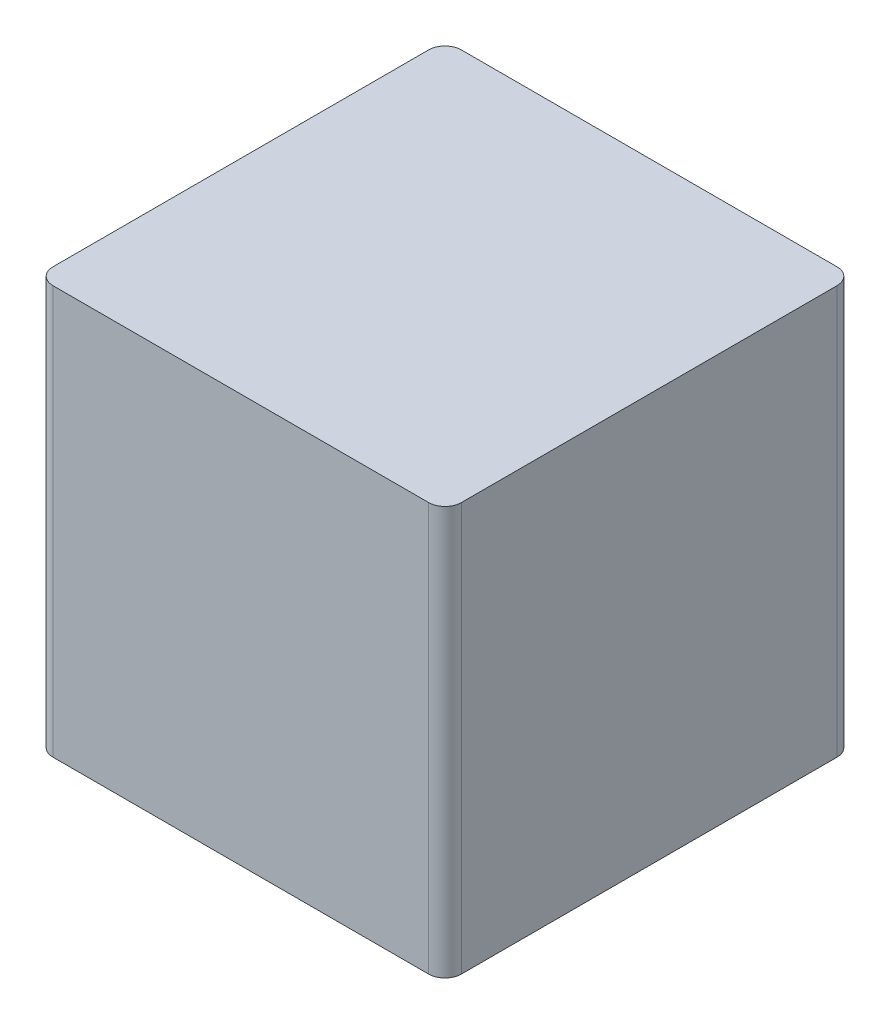
ISO-10303-21;
HEADER;
FILE_DESCRIPTION(('STEP AP214'),'2;1');
FILE_NAME('part.step','',(''),(''),'','','');
FILE_SCHEMA(('AUTOMOTIVE_DESIGN { 1 0 10303 214 1 1 1 1 }'));
ENDSEC;
DATA;
#1=APPLICATION_CONTEXT('core data for automotive mechanical design processes');
#2=APPLICATION_PROTOCOL_DEFINITION('international standard','automotive_design',2000,#1);
#3=PRODUCT_CONTEXT('',#1,'mechanical');
#4=PRODUCT('Part','Part','',(#3));
#5=PRODUCT_RELATED_PRODUCT_CATEGORY('part','',(#4));
#6=PRODUCT_DEFINITION_FORMATION('','',#4);
#7=PRODUCT_DEFINITION_CONTEXT('part definition',#1,'design');
#8=PRODUCT_DEFINITION('design','',#6,#7);
#9=PRODUCT_DEFINITION_SHAPE('','',#8);
#10=(LENGTH_UNIT() NAMED_UNIT(*) SI_UNIT(.MILLI.,.METRE.));
#11=(NAMED_UNIT(*) PLANE_ANGLE_UNIT() SI_UNIT($,.RADIAN.));
#12=(NAMED_UNIT(*) SI_UNIT($,.STERADIAN.) SOLID_ANGLE_UNIT());
#13=UNCERTAINTY_MEASURE_WITH_UNIT(LENGTH_MEASURE(1.E-05),#10,'distance_accuracy_value','');
#14=(GEOMETRIC_REPRESENTATION_CONTEXT(3) GLOBAL_UNCERTAINTY_ASSIGNED_CONTEXT((#13)) GLOBAL_UNIT_ASSIGNED_CONTEXT((#10,
#11,#12)) REPRESENTATION_CONTEXT('',''));
#15=CARTESIAN_POINT('',(0.,0.,0.));
#16=DIRECTION('',(0.,0.,1.));
#17=DIRECTION('',(1.,0.,0.));
#18=AXIS2_PLACEMENT_3D('',#15,#16,#17);
#19=CARTESIAN_POINT('',(31.75,63.5000000000001,31.75));
#20=DIRECTION('',(0.,0.,1.));
#21=DIRECTION('',(1.,0.,0.));
#22=AXIS2_PLACEMENT_3D('',#19,#20,#21);
#23=PLANE('',#22);
#24=DIRECTION('',(-1.,0.,0.));
#25=VECTOR('',#24,1.);
#26=CARTESIAN_POINT('',(31.75,63.5000000000001,31.75));
#27=LINE('',#26,#25);
#28=CARTESIAN_POINT('',(29.21,63.5000000000001,31.75));
#29=VERTEX_POINT('',#28);
#30=CARTESIAN_POINT('',(-29.21,63.5000000000001,31.75));
#31=VERTEX_POINT('',#30);
#32=EDGE_CURVE('E195',#29,#31,#27,.T.);
#33=ORIENTED_EDGE('',*,*,#32,.T.);
#34=DIRECTION('',(0.,-1.,0.));
#35=VECTOR('',#34,1.);
#36=CARTESIAN_POINT('',(-29.21,0.,31.75));
#37=LINE('',#36,#35);
#38=CARTESIAN_POINT('',(-29.21,0.,31.75));
#39=VERTEX_POINT('',#38);
#40=EDGE_CURVE('E124',#31,#39,#37,.T.);
#41=ORIENTED_EDGE('',*,*,#40,.T.);
#42=DIRECTION('',(-1.,0.,0.));
#43=VECTOR('',#42,1.);
#44=CARTESIAN_POINT('',(31.75,0.,31.75));
#45=LINE('',#44,#43);
#46=CARTESIAN_POINT('',(29.21,0.,31.75));
#47=VERTEX_POINT('',#46);
#48=EDGE_CURVE('E115',#47,#39,#45,.T.);
#49=ORIENTED_EDGE('',*,*,#48,.F.);
#50=DIRECTION('',(0.,-1.,0.));
#51=VECTOR('',#50,1.);
#52=CARTESIAN_POINT('',(29.21,63.5000000000001,31.75));
#53=LINE('',#52,#51);
#54=EDGE_CURVE('E129',#47,#29,#53,.F.);
#55=ORIENTED_EDGE('',*,*,#54,.T.);
#56=EDGE_LOOP('',(#33,#41,#49,#55));
#57=FACE_BOUND('',#56,.T.);
#58=ADVANCED_FACE('F45',(#57),#23,.T.);
#59=CARTESIAN_POINT('',(31.75,63.5000000000001,-31.75));
#60=DIRECTION('',(1.,0.,0.));
#61=DIRECTION('',(0.,0.,-1.));
#62=AXIS2_PLACEMENT_3D('',#59,#60,#61);
#63=PLANE('',#62);
#64=DIRECTION('',(0.,0.,1.));
#65=VECTOR('',#64,1.);
#66=CARTESIAN_POINT('',(31.75,0.,-31.75));
#67=LINE('',#66,#65);
#68=CARTESIAN_POINT('',(31.75,0.,-29.21));
#69=VERTEX_POINT('',#68);
#70=CARTESIAN_POINT('',(31.75,0.,29.21));
#71=VERTEX_POINT('',#70);
#72=EDGE_CURVE('E117',#69,#71,#67,.T.);
#73=ORIENTED_EDGE('',*,*,#72,.F.);
#74=DIRECTION('',(0.,-1.,0.));
#75=VECTOR('',#74,1.);
#76=CARTESIAN_POINT('',(31.75,63.5000000000001,-29.21));
#77=LINE('',#76,#75);
#78=CARTESIAN_POINT('',(31.75,63.5000000000001,-29.21));
#79=VERTEX_POINT('',#78);
#80=EDGE_CURVE('E11',#69,#79,#77,.F.);
#81=ORIENTED_EDGE('',*,*,#80,.T.);
#82=DIRECTION('',(0.,0.,1.));
#83=VECTOR('',#82,1.);
#84=CARTESIAN_POINT('',(31.75,63.5000000000001,-31.75));
#85=LINE('',#84,#83);
#86=CARTESIAN_POINT('',(31.75,63.5000000000001,29.21));
#87=VERTEX_POINT('',#86);
#88=EDGE_CURVE('E138',#79,#87,#85,.T.);
#89=ORIENTED_EDGE('',*,*,#88,.T.);
#90=DIRECTION('',(0.,-1.,0.));
#91=VECTOR('',#90,1.);
#92=CARTESIAN_POINT('',(31.75,63.5000000000001,29.21));
#93=LINE('',#92,#91);
#94=EDGE_CURVE('E54',#87,#71,#93,.T.);
#95=ORIENTED_EDGE('',*,*,#94,.T.);
#96=EDGE_LOOP('',(#73,#81,#89,#95));
#97=FACE_BOUND('',#96,.T.);
#98=ADVANCED_FACE('F181',(#97),#63,.T.);
#99=CARTESIAN_POINT('',(31.75,63.5000000000001,-31.75));
#100=DIRECTION('',(0.,0.,1.));
#101=DIRECTION('',(1.,0.,0.));
#102=AXIS2_PLACEMENT_3D('',#99,#100,#101);
#103=PLANE('',#102);
#104=DIRECTION('',(-1.,0.,0.));
#105=VECTOR('',#104,1.);
#106=CARTESIAN_POINT('',(31.75,0.,-31.75));
#107=LINE('',#106,#105);
#108=CARTESIAN_POINT('',(29.21,0.,-31.75));
#109=VERTEX_POINT('',#108);
#110=CARTESIAN_POINT('',(-29.21,0.,-31.75));
#111=VERTEX_POINT('',#110);
#112=EDGE_CURVE('E190',#109,#111,#107,.T.);
#113=ORIENTED_EDGE('',*,*,#112,.T.);
#114=DIRECTION('',(0.,-1.,0.));
#115=VECTOR('',#114,1.);
#116=CARTESIAN_POINT('',(-29.21,63.5000000000001,-31.75));
#117=LINE('',#116,#115);
#118=CARTESIAN_POINT('',(-29.21,63.5000000000001,-31.75));
#119=VERTEX_POINT('',#118);
#120=EDGE_CURVE('E61',#111,#119,#117,.F.);
#121=ORIENTED_EDGE('',*,*,#120,.T.);
#122=DIRECTION('',(-1.,0.,0.));
#123=VECTOR('',#122,1.);
#124=CARTESIAN_POINT('',(31.75,63.5000000000001,-31.75));
#125=LINE('',#124,#123);
#126=CARTESIAN_POINT('',(29.21,63.5000000000001,-31.75));
#127=VERTEX_POINT('',#126);
#128=EDGE_CURVE('E144',#127,#119,#125,.T.);
#129=ORIENTED_EDGE('',*,*,#128,.F.);
#130=DIRECTION('',(0.,-1.,0.));
#131=VECTOR('',#130,1.);
#132=CARTESIAN_POINT('',(29.21,0.,-31.75));
#133=LINE('',#132,#131);
#134=EDGE_CURVE('E174',#127,#109,#133,.T.);
#135=ORIENTED_EDGE('',*,*,#134,.T.);
#136=EDGE_LOOP('',(#113,#121,#129,#135));
#137=FACE_BOUND('',#136,.T.);
#138=ADVANCED_FACE('F189',(#137),#103,.F.);
#139=CARTESIAN_POINT('',(-31.75,63.5000000000001,-31.75));
#140=DIRECTION('',(1.,0.,0.));
#141=DIRECTION('',(0.,0.,-1.));
#142=AXIS2_PLACEMENT_3D('',#139,#140,#141);
#143=PLANE('',#142);
#144=DIRECTION('',(0.,0.,1.));
#145=VECTOR('',#144,1.);
#146=CARTESIAN_POINT('',(-31.75,0.,-31.75));
#147=LINE('',#146,#145);
#148=CARTESIAN_POINT('',(-31.75,0.,-29.21));
#149=VERTEX_POINT('',#148);
#150=CARTESIAN_POINT('',(-31.75,0.,29.21));
#151=VERTEX_POINT('',#150);
#152=EDGE_CURVE('E133',#149,#151,#147,.T.);
#153=ORIENTED_EDGE('',*,*,#152,.T.);
#154=DIRECTION('',(0.,-1.,0.));
#155=VECTOR('',#154,1.);
#156=CARTESIAN_POINT('',(-31.75,63.5000000000001,29.21));
#157=LINE('',#156,#155);
#158=CARTESIAN_POINT('',(-31.75,63.5000000000001,29.21));
#159=VERTEX_POINT('',#158);
#160=EDGE_CURVE('E161',#151,#159,#157,.F.);
#161=ORIENTED_EDGE('',*,*,#160,.T.);
#162=DIRECTION('',(0.,0.,1.));
#163=VECTOR('',#162,1.);
#164=CARTESIAN_POINT('',(-31.75,63.5000000000001,-31.75));
#165=LINE('',#164,#163);
#166=CARTESIAN_POINT('',(-31.75,63.5000000000001,-29.21));
#167=VERTEX_POINT('',#166);
#168=EDGE_CURVE('E201',#167,#159,#165,.T.);
#169=ORIENTED_EDGE('',*,*,#168,.F.);
#170=DIRECTION('',(0.,-1.,0.));
#171=VECTOR('',#170,1.);
#172=CARTESIAN_POINT('',(-31.75,63.5000000000001,-29.21));
#173=LINE('',#172,#171);
#174=EDGE_CURVE('E157',#167,#149,#173,.T.);
#175=ORIENTED_EDGE('',*,*,#174,.T.);
#176=EDGE_LOOP('',(#153,#161,#169,#175));
#177=FACE_BOUND('',#176,.T.);
#178=ADVANCED_FACE('F210',(#177),#143,.F.);
#179=CARTESIAN_POINT('',(0.,63.5000000000001,0.));
#180=DIRECTION('',(0.,1.,0.));
#181=DIRECTION('',(0.,0.,1.));
#182=AXIS2_PLACEMENT_3D('',#179,#180,#181);
#183=PLANE('',#182);
#184=ORIENTED_EDGE('',*,*,#168,.T.);
#185=CARTESIAN_POINT('',(-29.21,63.5000000000001,29.21));
#186=DIRECTION('',(0.,1.,0.));
#187=DIRECTION('',(0.,0.,1.));
#188=AXIS2_PLACEMENT_3D('',#185,#186,#187);
#189=CIRCLE('',#188,2.54);
#190=EDGE_CURVE('E171',#159,#31,#189,.T.);
#191=ORIENTED_EDGE('',*,*,#190,.T.);
#192=ORIENTED_EDGE('',*,*,#32,.F.);
#193=CARTESIAN_POINT('',(29.21,63.5000000000001,29.21));
#194=DIRECTION('',(0.,1.,0.));
#195=DIRECTION('',(0.,0.,1.));
#196=AXIS2_PLACEMENT_3D('',#193,#194,#195);
#197=CIRCLE('',#196,2.54);
#198=EDGE_CURVE('E136',#29,#87,#197,.T.);
#199=ORIENTED_EDGE('',*,*,#198,.T.);
#200=ORIENTED_EDGE('',*,*,#88,.F.);
#201=CARTESIAN_POINT('',(29.21,63.5000000000001,-29.21));
#202=DIRECTION('',(0.,1.,0.));
#203=DIRECTION('',(0.,0.,1.));
#204=AXIS2_PLACEMENT_3D('',#201,#202,#203);
#205=CIRCLE('',#204,2.54);
#206=EDGE_CURVE('E68',#79,#127,#205,.T.);
#207=ORIENTED_EDGE('',*,*,#206,.T.);
#208=ORIENTED_EDGE('',*,*,#128,.T.);
#209=CARTESIAN_POINT('',(-29.21,63.5000000000001,-29.21));
#210=DIRECTION('',(0.,1.,0.));
#211=DIRECTION('',(0.,0.,1.));
#212=AXIS2_PLACEMENT_3D('',#209,#210,#211);
#213=CIRCLE('',#212,2.54);
#214=EDGE_CURVE('E168',#119,#167,#213,.T.);
#215=ORIENTED_EDGE('',*,*,#214,.T.);
#216=EDGE_LOOP('',(#184,#191,#192,#199,#200,#207,#208,#215));
#217=FACE_BOUND('',#216,.T.);
#218=ADVANCED_FACE('F184',(#217),#183,.T.);
#219=CARTESIAN_POINT('',(0.,0.,0.));
#220=DIRECTION('',(0.,1.,0.));
#221=DIRECTION('',(0.,0.,1.));
#222=AXIS2_PLACEMENT_3D('',#219,#220,#221);
#223=PLANE('',#222);
#224=ORIENTED_EDGE('',*,*,#48,.T.);
#225=CARTESIAN_POINT('',(-29.21,0.,29.21));
#226=DIRECTION('',(0.,1.,0.));
#227=DIRECTION('',(0.,0.,1.));
#228=AXIS2_PLACEMENT_3D('',#225,#226,#227);
#229=CIRCLE('',#228,2.54);
#230=EDGE_CURVE('E154',#39,#151,#229,.F.);
#231=ORIENTED_EDGE('',*,*,#230,.T.);
#232=ORIENTED_EDGE('',*,*,#152,.F.);
#233=CARTESIAN_POINT('',(-29.21,0.,-29.21));
#234=DIRECTION('',(0.,1.,0.));
#235=DIRECTION('',(0.,0.,1.));
#236=AXIS2_PLACEMENT_3D('',#233,#234,#235);
#237=CIRCLE('',#236,2.54);
#238=EDGE_CURVE('E151',#149,#111,#237,.F.);
#239=ORIENTED_EDGE('',*,*,#238,.T.);
#240=ORIENTED_EDGE('',*,*,#112,.F.);
#241=CARTESIAN_POINT('',(29.21,0.,-29.21));
#242=DIRECTION('',(0.,1.,0.));
#243=DIRECTION('',(0.,0.,1.));
#244=AXIS2_PLACEMENT_3D('',#241,#242,#243);
#245=CIRCLE('',#244,2.54);
#246=EDGE_CURVE('E123',#109,#69,#245,.F.);
#247=ORIENTED_EDGE('',*,*,#246,.T.);
#248=ORIENTED_EDGE('',*,*,#72,.T.);
#249=CARTESIAN_POINT('',(29.21,0.,29.21));
#250=DIRECTION('',(0.,1.,0.));
#251=DIRECTION('',(0.,0.,1.));
#252=AXIS2_PLACEMENT_3D('',#249,#250,#251);
#253=CIRCLE('',#252,2.54);
#254=EDGE_CURVE('E112',#71,#47,#253,.F.);
#255=ORIENTED_EDGE('',*,*,#254,.T.);
#256=EDGE_LOOP('',(#224,#231,#232,#239,#240,#247,#248,#255));
#257=FACE_BOUND('',#256,.T.);
#258=ADVANCED_FACE('F114',(#257),#223,.F.);
#259=CARTESIAN_POINT('',(-29.21,63.5000000000001,29.21));
#260=DIRECTION('',(0.,1.,0.));
#261=DIRECTION('',(0.,0.,1.));
#262=AXIS2_PLACEMENT_3D('',#259,#260,#261);
#263=CYLINDRICAL_SURFACE('',#262,2.54);
#264=ORIENTED_EDGE('',*,*,#190,.F.);
#265=ORIENTED_EDGE('',*,*,#160,.F.);
#266=ORIENTED_EDGE('',*,*,#230,.F.);
#267=ORIENTED_EDGE('',*,*,#40,.F.);
#268=EDGE_LOOP('',(#264,#265,#266,#267));
#269=FACE_BOUND('',#268,.T.);
#270=ADVANCED_FACE('F207',(#269),#263,.T.);
#271=CARTESIAN_POINT('',(-29.21,63.5000000000001,-29.21));
#272=DIRECTION('',(0.,-1.,0.));
#273=DIRECTION('',(0.,0.,-1.));
#274=AXIS2_PLACEMENT_3D('',#271,#272,#273);
#275=CYLINDRICAL_SURFACE('',#274,2.54);
#276=ORIENTED_EDGE('',*,*,#214,.F.);
#277=ORIENTED_EDGE('',*,*,#120,.F.);
#278=ORIENTED_EDGE('',*,*,#238,.F.);
#279=ORIENTED_EDGE('',*,*,#174,.F.);
#280=EDGE_LOOP('',(#276,#277,#278,#279));
#281=FACE_BOUND('',#280,.T.);
#282=ADVANCED_FACE('F215',(#281),#275,.T.);
#283=CARTESIAN_POINT('',(29.21,63.5000000000001,-29.21));
#284=DIRECTION('',(0.,1.,0.));
#285=DIRECTION('',(0.,0.,1.));
#286=AXIS2_PLACEMENT_3D('',#283,#284,#285);
#287=CYLINDRICAL_SURFACE('',#286,2.54);
#288=ORIENTED_EDGE('',*,*,#206,.F.);
#289=ORIENTED_EDGE('',*,*,#80,.F.);
#290=ORIENTED_EDGE('',*,*,#246,.F.);
#291=ORIENTED_EDGE('',*,*,#134,.F.);
#292=EDGE_LOOP('',(#288,#289,#290,#291));
#293=FACE_BOUND('',#292,.T.);
#294=ADVANCED_FACE('F187',(#293),#287,.T.);
#295=CARTESIAN_POINT('',(29.21,63.5000000000001,29.21));
#296=DIRECTION('',(0.,-1.,0.));
#297=DIRECTION('',(0.,0.,-1.));
#298=AXIS2_PLACEMENT_3D('',#295,#296,#297);
#299=CYLINDRICAL_SURFACE('',#298,2.54);
#300=ORIENTED_EDGE('',*,*,#198,.F.);
#301=ORIENTED_EDGE('',*,*,#54,.F.);
#302=ORIENTED_EDGE('',*,*,#254,.F.);
#303=ORIENTED_EDGE('',*,*,#94,.F.);
#304=EDGE_LOOP('',(#300,#301,#302,#303));
#305=FACE_BOUND('',#304,.T.);
#306=ADVANCED_FACE('F47',(#305),#299,.T.);
#307=CLOSED_SHELL('',(#58,#98,#138,#178,#218,#258,#270,#282,#294,#306));
#308=MANIFOLD_SOLID_BREP('B2',#307);
#309=ADVANCED_BREP_SHAPE_REPRESENTATION('',(#18,#308),#14);
#310=SHAPE_DEFINITION_REPRESENTATION(#9,#309);
ENDSEC;
END-ISO-10303-21;
